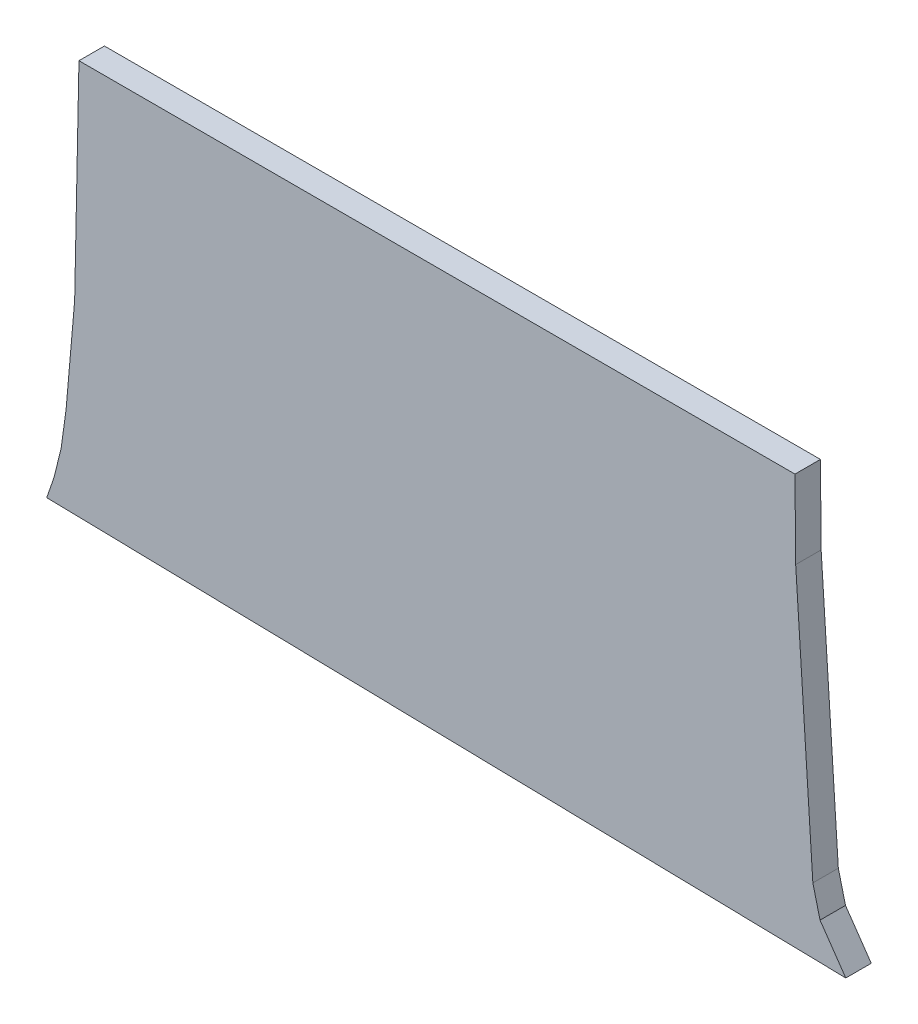
ISO-10303-21;
HEADER;
FILE_DESCRIPTION(('STEP AP214'),'2;1');
FILE_NAME('part.step','',(''),(''),'','','');
FILE_SCHEMA(('AUTOMOTIVE_DESIGN { 1 0 10303 214 1 1 1 1 }'));
ENDSEC;
DATA;
#1=APPLICATION_CONTEXT('core data for automotive mechanical design processes');
#2=APPLICATION_PROTOCOL_DEFINITION('international standard','automotive_design',2000,#1);
#3=PRODUCT_CONTEXT('',#1,'mechanical');
#4=PRODUCT('Part','Part','',(#3));
#5=PRODUCT_RELATED_PRODUCT_CATEGORY('part','',(#4));
#6=PRODUCT_DEFINITION_FORMATION('','',#4);
#7=PRODUCT_DEFINITION_CONTEXT('part definition',#1,'design');
#8=PRODUCT_DEFINITION('design','',#6,#7);
#9=PRODUCT_DEFINITION_SHAPE('','',#8);
#10=(LENGTH_UNIT() NAMED_UNIT(*) SI_UNIT(.MILLI.,.METRE.));
#11=(NAMED_UNIT(*) PLANE_ANGLE_UNIT() SI_UNIT($,.RADIAN.));
#12=(NAMED_UNIT(*) SI_UNIT($,.STERADIAN.) SOLID_ANGLE_UNIT());
#13=UNCERTAINTY_MEASURE_WITH_UNIT(LENGTH_MEASURE(1.E-05),#10,'distance_accuracy_value','');
#14=(GEOMETRIC_REPRESENTATION_CONTEXT(3) GLOBAL_UNCERTAINTY_ASSIGNED_CONTEXT((#13)) GLOBAL_UNIT_ASSIGNED_CONTEXT((#10,
#11,#12)) REPRESENTATION_CONTEXT('',''));
#15=CARTESIAN_POINT('',(0.,0.,0.));
#16=DIRECTION('',(0.,0.,1.));
#17=DIRECTION('',(1.,0.,0.));
#18=AXIS2_PLACEMENT_3D('',#15,#16,#17);
#19=CARTESIAN_POINT('',(34.8600006103516,114.917999267578,0.));
#20=DIRECTION('',(0.999790358166141,-0.0204753441489863,0.));
#21=DIRECTION('',(-0.0204753441489863,-0.999790358166141,0.));
#22=AXIS2_PLACEMENT_3D('',#19,#20,#21);
#23=PLANE('',#22);
#24=DIRECTION('',(-0.0204753441489863,-0.999790358166141,0.));
#25=VECTOR('',#24,1.);
#26=CARTESIAN_POINT('',(34.8600006103516,114.917999267578,0.03556));
#27=LINE('',#26,#25);
#28=CARTESIAN_POINT('',(34.8600006103516,114.917999267578,0.03556));
#29=VERTEX_POINT('',#28);
#30=CARTESIAN_POINT('',(34.8540000915527,114.625,0.03556));
#31=VERTEX_POINT('',#30);
#32=EDGE_CURVE('E11',#29,#31,#27,.T.);
#33=ORIENTED_EDGE('',*,*,#32,.F.);
#34=DIRECTION('',(0.,0.,1.));
#35=VECTOR('',#34,1.);
#36=CARTESIAN_POINT('',(34.8600006103516,114.917999267578,0.));
#37=LINE('',#36,#35);
#38=CARTESIAN_POINT('',(34.8600006103516,114.917999267578,0.));
#39=VERTEX_POINT('',#38);
#40=EDGE_CURVE('E24',#39,#29,#37,.T.);
#41=ORIENTED_EDGE('',*,*,#40,.F.);
#42=DIRECTION('',(-0.0204753441489863,-0.999790358166141,0.));
#43=VECTOR('',#42,1.);
#44=CARTESIAN_POINT('',(34.8600006103516,114.917999267578,0.));
#45=LINE('',#44,#43);
#46=CARTESIAN_POINT('',(34.8540000915527,114.625,0.));
#47=VERTEX_POINT('',#46);
#48=EDGE_CURVE('E118',#39,#47,#45,.T.);
#49=ORIENTED_EDGE('',*,*,#48,.T.);
#50=DIRECTION('',(0.,0.,1.));
#51=VECTOR('',#50,1.);
#52=CARTESIAN_POINT('',(34.8540000915527,114.625,0.));
#53=LINE('',#52,#51);
#54=EDGE_CURVE('E37',#47,#31,#53,.T.);
#55=ORIENTED_EDGE('',*,*,#54,.T.);
#56=EDGE_LOOP('',(#33,#41,#49,#55));
#57=FACE_BOUND('',#56,.T.);
#58=ADVANCED_FACE('F17',(#57),#23,.F.);
#59=CARTESIAN_POINT('',(34.8540000915527,114.625,0.));
#60=DIRECTION('',(0.99623996816194,-0.0866367464572496,0.));
#61=DIRECTION('',(-0.0866367464572496,-0.99623996816194,0.));
#62=AXIS2_PLACEMENT_3D('',#59,#60,#61);
#63=PLANE('',#62);
#64=DIRECTION('',(-0.0866367464572496,-0.99623996816194,0.));
#65=VECTOR('',#64,1.);
#66=CARTESIAN_POINT('',(34.8540000915527,114.625,0.03556));
#67=LINE('',#66,#65);
#68=CARTESIAN_POINT('',(34.8419990539551,114.486999511719,0.03556));
#69=VERTEX_POINT('',#68);
#70=EDGE_CURVE('E182',#31,#69,#67,.T.);
#71=ORIENTED_EDGE('',*,*,#70,.F.);
#72=ORIENTED_EDGE('',*,*,#54,.F.);
#73=DIRECTION('',(-0.0866367464572496,-0.99623996816194,0.));
#74=VECTOR('',#73,1.);
#75=CARTESIAN_POINT('',(34.8540000915527,114.625,0.));
#76=LINE('',#75,#74);
#77=CARTESIAN_POINT('',(34.8419990539551,114.486999511719,0.));
#78=VERTEX_POINT('',#77);
#79=EDGE_CURVE('E179',#47,#78,#76,.T.);
#80=ORIENTED_EDGE('',*,*,#79,.T.);
#81=DIRECTION('',(0.,0.,1.));
#82=VECTOR('',#81,1.);
#83=CARTESIAN_POINT('',(34.8419990539551,114.486999511719,0.));
#84=LINE('',#83,#82);
#85=EDGE_CURVE('E177',#78,#69,#84,.T.);
#86=ORIENTED_EDGE('',*,*,#85,.T.);
#87=EDGE_LOOP('',(#71,#72,#80,#86));
#88=FACE_BOUND('',#87,.T.);
#89=ADVANCED_FACE('F190',(#88),#63,.F.);
#90=CARTESIAN_POINT('',(34.8419990539551,114.486999511719,0.));
#91=DIRECTION('',(0.990712558253608,-0.135972890381105,0.));
#92=DIRECTION('',(-0.135972890381105,-0.990712558253608,0.));
#93=AXIS2_PLACEMENT_3D('',#90,#91,#92);
#94=PLANE('',#93);
#95=DIRECTION('',(-0.135972890381105,-0.990712558253608,0.));
#96=VECTOR('',#95,1.);
#97=CARTESIAN_POINT('',(34.8419990539551,114.486999511719,0.03556));
#98=LINE('',#97,#96);
#99=CARTESIAN_POINT('',(34.8349990844727,114.435997009277,0.03556));
#100=VERTEX_POINT('',#99);
#101=EDGE_CURVE('E174',#69,#100,#98,.T.);
#102=ORIENTED_EDGE('',*,*,#101,.F.);
#103=ORIENTED_EDGE('',*,*,#85,.F.);
#104=DIRECTION('',(-0.135972890381105,-0.990712558253608,0.));
#105=VECTOR('',#104,1.);
#106=CARTESIAN_POINT('',(34.8419990539551,114.486999511719,0.));
#107=LINE('',#106,#105);
#108=CARTESIAN_POINT('',(34.8349990844727,114.435997009277,0.));
#109=VERTEX_POINT('',#108);
#110=EDGE_CURVE('E171',#78,#109,#107,.T.);
#111=ORIENTED_EDGE('',*,*,#110,.T.);
#112=DIRECTION('',(0.,0.,1.));
#113=VECTOR('',#112,1.);
#114=CARTESIAN_POINT('',(34.8349990844727,114.435997009277,0.));
#115=LINE('',#114,#113);
#116=EDGE_CURVE('E169',#109,#100,#115,.T.);
#117=ORIENTED_EDGE('',*,*,#116,.T.);
#118=EDGE_LOOP('',(#102,#103,#111,#117));
#119=FACE_BOUND('',#118,.T.);
#120=ADVANCED_FACE('F196',(#119),#94,.F.);
#121=CARTESIAN_POINT('',(34.8349990844727,114.435997009277,0.));
#122=DIRECTION('',(0.970142500145332,-0.242535625036333,0.));
#123=DIRECTION('',(-0.242535625036333,-0.970142500145332,0.));
#124=AXIS2_PLACEMENT_3D('',#121,#122,#123);
#125=PLANE('',#124);
#126=DIRECTION('',(-0.242535625036333,-0.970142500145332,0.));
#127=VECTOR('',#126,1.);
#128=CARTESIAN_POINT('',(34.8349990844727,114.435997009277,0.03556));
#129=LINE('',#128,#127);
#130=CARTESIAN_POINT('',(34.8250007629395,114.396003723145,0.03556));
#131=VERTEX_POINT('',#130);
#132=EDGE_CURVE('E166',#100,#131,#129,.T.);
#133=ORIENTED_EDGE('',*,*,#132,.F.);
#134=ORIENTED_EDGE('',*,*,#116,.F.);
#135=DIRECTION('',(-0.242535625036333,-0.970142500145332,0.));
#136=VECTOR('',#135,1.);
#137=CARTESIAN_POINT('',(34.8349990844727,114.435997009277,0.));
#138=LINE('',#137,#136);
#139=CARTESIAN_POINT('',(34.8250007629395,114.396003723145,0.));
#140=VERTEX_POINT('',#139);
#141=EDGE_CURVE('E163',#109,#140,#138,.T.);
#142=ORIENTED_EDGE('',*,*,#141,.T.);
#143=DIRECTION('',(0.,0.,1.));
#144=VECTOR('',#143,1.);
#145=CARTESIAN_POINT('',(34.8250007629395,114.396003723145,0.));
#146=LINE('',#145,#144);
#147=EDGE_CURVE('E161',#140,#131,#146,.T.);
#148=ORIENTED_EDGE('',*,*,#147,.T.);
#149=EDGE_LOOP('',(#133,#134,#142,#148));
#150=FACE_BOUND('',#149,.T.);
#151=ADVANCED_FACE('F198',(#150),#125,.F.);
#152=CARTESIAN_POINT('',(34.8250007629395,114.396003723145,0.));
#153=DIRECTION('',(0.945375624020181,-0.325983020276291,0.));
#154=DIRECTION('',(-0.325983020276291,-0.945375624020181,0.));
#155=AXIS2_PLACEMENT_3D('',#152,#153,#154);
#156=PLANE('',#155);
#157=DIRECTION('',(-0.325983020276291,-0.945375624020181,0.));
#158=VECTOR('',#157,1.);
#159=CARTESIAN_POINT('',(34.8250007629395,114.396003723145,0.03556));
#160=LINE('',#159,#158);
#161=CARTESIAN_POINT('',(34.814998626709,114.366996765137,0.03556));
#162=VERTEX_POINT('',#161);
#163=EDGE_CURVE('E158',#131,#162,#160,.T.);
#164=ORIENTED_EDGE('',*,*,#163,.F.);
#165=ORIENTED_EDGE('',*,*,#147,.F.);
#166=DIRECTION('',(-0.325983020276291,-0.945375624020181,0.));
#167=VECTOR('',#166,1.);
#168=CARTESIAN_POINT('',(34.8250007629395,114.396003723145,0.));
#169=LINE('',#168,#167);
#170=CARTESIAN_POINT('',(34.814998626709,114.366996765137,0.));
#171=VERTEX_POINT('',#170);
#172=EDGE_CURVE('E155',#140,#171,#169,.T.);
#173=ORIENTED_EDGE('',*,*,#172,.T.);
#174=DIRECTION('',(0.,0.,1.));
#175=VECTOR('',#174,1.);
#176=CARTESIAN_POINT('',(34.814998626709,114.366996765137,0.));
#177=LINE('',#176,#175);
#178=EDGE_CURVE('E153',#171,#162,#177,.T.);
#179=ORIENTED_EDGE('',*,*,#178,.T.);
#180=EDGE_LOOP('',(#164,#165,#173,#179));
#181=FACE_BOUND('',#180,.T.);
#182=ADVANCED_FACE('F203',(#181),#156,.F.);
#183=CARTESIAN_POINT('',(34.814998626709,114.366996765137,0.));
#184=DIRECTION('',(0.0206004409063565,0.99978778840035,0.));
#185=DIRECTION('',(0.99978778840035,-0.0206004409063565,0.));
#186=AXIS2_PLACEMENT_3D('',#183,#184,#185);
#187=PLANE('',#186);
#188=DIRECTION('',(0.99978778840035,-0.0206004409063565,0.));
#189=VECTOR('',#188,1.);
#190=CARTESIAN_POINT('',(34.814998626709,114.366996765137,0.03556));
#191=LINE('',#190,#189);
#192=CARTESIAN_POINT('',(35.9309997558594,114.34400177002,0.03556));
#193=VERTEX_POINT('',#192);
#194=EDGE_CURVE('E150',#162,#193,#191,.T.);
#195=ORIENTED_EDGE('',*,*,#194,.F.);
#196=ORIENTED_EDGE('',*,*,#178,.F.);
#197=DIRECTION('',(0.99978778840035,-0.0206004409063565,0.));
#198=VECTOR('',#197,1.);
#199=CARTESIAN_POINT('',(34.814998626709,114.366996765137,0.));
#200=LINE('',#199,#198);
#201=CARTESIAN_POINT('',(35.9309997558594,114.34400177002,0.));
#202=VERTEX_POINT('',#201);
#203=EDGE_CURVE('E147',#171,#202,#200,.T.);
#204=ORIENTED_EDGE('',*,*,#203,.T.);
#205=DIRECTION('',(0.,0.,1.));
#206=VECTOR('',#205,1.);
#207=CARTESIAN_POINT('',(35.9309997558594,114.34400177002,0.));
#208=LINE('',#207,#206);
#209=EDGE_CURVE('E145',#202,#193,#208,.T.);
#210=ORIENTED_EDGE('',*,*,#209,.T.);
#211=EDGE_LOOP('',(#195,#196,#204,#210));
#212=FACE_BOUND('',#211,.T.);
#213=ADVANCED_FACE('F206',(#212),#187,.F.);
#214=CARTESIAN_POINT('',(35.9309997558594,114.34400177002,0.));
#215=DIRECTION('',(-0.822207390607001,-0.569188024146,0.));
#216=DIRECTION('',(-0.569188024146,0.822207390607001,0.));
#217=AXIS2_PLACEMENT_3D('',#214,#215,#216);
#218=PLANE('',#217);
#219=DIRECTION('',(-0.569188024146,0.822207390607001,0.));
#220=VECTOR('',#219,1.);
#221=CARTESIAN_POINT('',(35.9309997558594,114.34400177002,0.03556));
#222=LINE('',#221,#220);
#223=CARTESIAN_POINT('',(35.8950004577637,114.396003723145,0.03556));
#224=VERTEX_POINT('',#223);
#225=EDGE_CURVE('E142',#193,#224,#222,.T.);
#226=ORIENTED_EDGE('',*,*,#225,.F.);
#227=ORIENTED_EDGE('',*,*,#209,.F.);
#228=DIRECTION('',(-0.569188024146,0.822207390607001,0.));
#229=VECTOR('',#228,1.);
#230=CARTESIAN_POINT('',(35.9309997558594,114.34400177002,0.));
#231=LINE('',#230,#229);
#232=CARTESIAN_POINT('',(35.8950004577637,114.396003723145,0.));
#233=VERTEX_POINT('',#232);
#234=EDGE_CURVE('E139',#202,#233,#231,.T.);
#235=ORIENTED_EDGE('',*,*,#234,.T.);
#236=DIRECTION('',(0.,0.,1.));
#237=VECTOR('',#236,1.);
#238=CARTESIAN_POINT('',(35.8950004577637,114.396003723145,0.));
#239=LINE('',#238,#237);
#240=EDGE_CURVE('E137',#233,#224,#239,.T.);
#241=ORIENTED_EDGE('',*,*,#240,.T.);
#242=EDGE_LOOP('',(#226,#227,#235,#241));
#243=FACE_BOUND('',#242,.T.);
#244=ADVANCED_FACE('F211',(#243),#218,.F.);
#245=CARTESIAN_POINT('',(35.8950004577637,114.396003723145,0.));
#246=DIRECTION('',(-0.970120723659025,-0.242622714367986,0.));
#247=DIRECTION('',(-0.242622714367986,0.970120723659025,0.));
#248=AXIS2_PLACEMENT_3D('',#245,#246,#247);
#249=PLANE('',#248);
#250=DIRECTION('',(-0.242622714367986,0.970120723659025,0.));
#251=VECTOR('',#250,1.);
#252=CARTESIAN_POINT('',(35.8950004577637,114.396003723145,0.03556));
#253=LINE('',#252,#251);
#254=CARTESIAN_POINT('',(35.8849983215332,114.435997009277,0.03556));
#255=VERTEX_POINT('',#254);
#256=EDGE_CURVE('E134',#224,#255,#253,.T.);
#257=ORIENTED_EDGE('',*,*,#256,.F.);
#258=ORIENTED_EDGE('',*,*,#240,.F.);
#259=DIRECTION('',(-0.242622714367986,0.970120723659025,0.));
#260=VECTOR('',#259,1.);
#261=CARTESIAN_POINT('',(35.8950004577637,114.396003723145,0.));
#262=LINE('',#261,#260);
#263=CARTESIAN_POINT('',(35.8849983215332,114.435997009277,0.));
#264=VERTEX_POINT('',#263);
#265=EDGE_CURVE('E131',#233,#264,#262,.T.);
#266=ORIENTED_EDGE('',*,*,#265,.T.);
#267=DIRECTION('',(0.,0.,1.));
#268=VECTOR('',#267,1.);
#269=CARTESIAN_POINT('',(35.8849983215332,114.435997009277,0.));
#270=LINE('',#269,#268);
#271=EDGE_CURVE('E129',#264,#255,#270,.T.);
#272=ORIENTED_EDGE('',*,*,#271,.T.);
#273=EDGE_LOOP('',(#257,#258,#266,#272));
#274=FACE_BOUND('',#273,.T.);
#275=ADVANCED_FACE('F214',(#274),#249,.F.);
#276=CARTESIAN_POINT('',(35.8849983215332,114.435997009277,0.));
#277=DIRECTION('',(-0.997936694360059,-0.064205560894039,0.));
#278=DIRECTION('',(-0.064205560894039,0.997936694360059,0.));
#279=AXIS2_PLACEMENT_3D('',#276,#277,#278);
#280=PLANE('',#279);
#281=DIRECTION('',(-0.064205560894039,0.997936694360059,0.));
#282=VECTOR('',#281,1.);
#283=CARTESIAN_POINT('',(35.8849983215332,114.435997009277,0.03556));
#284=LINE('',#283,#282);
#285=CARTESIAN_POINT('',(35.8610000610351,114.80899810791,0.03556));
#286=VERTEX_POINT('',#285);
#287=EDGE_CURVE('E126',#255,#286,#284,.T.);
#288=ORIENTED_EDGE('',*,*,#287,.F.);
#289=ORIENTED_EDGE('',*,*,#271,.F.);
#290=DIRECTION('',(-0.064205560894039,0.997936694360059,0.));
#291=VECTOR('',#290,1.);
#292=CARTESIAN_POINT('',(35.8849983215332,114.435997009277,0.));
#293=LINE('',#292,#291);
#294=CARTESIAN_POINT('',(35.8610000610351,114.80899810791,0.));
#295=VERTEX_POINT('',#294);
#296=EDGE_CURVE('E124',#264,#295,#293,.T.);
#297=ORIENTED_EDGE('',*,*,#296,.T.);
#298=DIRECTION('',(0.,0.,1.));
#299=VECTOR('',#298,1.);
#300=CARTESIAN_POINT('',(35.8610000610351,114.80899810791,0.));
#301=LINE('',#300,#299);
#302=EDGE_CURVE('E109',#295,#286,#301,.T.);
#303=ORIENTED_EDGE('',*,*,#302,.T.);
#304=EDGE_LOOP('',(#288,#289,#297,#303));
#305=FACE_BOUND('',#304,.T.);
#306=ADVANCED_FACE('F217',(#305),#280,.F.);
#307=CARTESIAN_POINT('',(35.8610000610352,114.80899810791,0.));
#308=DIRECTION('',(-0.999957965767443,-0.0091687893550455,0.));
#309=DIRECTION('',(-0.0091687893550455,0.999957965767443,0.));
#310=AXIS2_PLACEMENT_3D('',#307,#308,#309);
#311=PLANE('',#310);
#312=DIRECTION('',(-0.0091687893550455,0.999957965767443,0.));
#313=VECTOR('',#312,1.);
#314=CARTESIAN_POINT('',(35.8610000610351,114.80899810791,0.03556));
#315=LINE('',#314,#313);
#316=CARTESIAN_POINT('',(35.8600006103516,114.917999267578,0.03556));
#317=VERTEX_POINT('',#316);
#318=EDGE_CURVE('E113',#286,#317,#315,.T.);
#319=ORIENTED_EDGE('',*,*,#318,.F.);
#320=ORIENTED_EDGE('',*,*,#302,.F.);
#321=DIRECTION('',(-0.0091687893550455,0.999957965767443,0.));
#322=VECTOR('',#321,1.);
#323=CARTESIAN_POINT('',(35.8610000610351,114.80899810791,0.));
#324=LINE('',#323,#322);
#325=CARTESIAN_POINT('',(35.8600006103516,114.917999267578,0.));
#326=VERTEX_POINT('',#325);
#327=EDGE_CURVE('E105',#295,#326,#324,.T.);
#328=ORIENTED_EDGE('',*,*,#327,.T.);
#329=DIRECTION('',(0.,0.,1.));
#330=VECTOR('',#329,1.);
#331=CARTESIAN_POINT('',(35.8600006103516,114.917999267578,0.));
#332=LINE('',#331,#330);
#333=EDGE_CURVE('E95',#326,#317,#332,.T.);
#334=ORIENTED_EDGE('',*,*,#333,.T.);
#335=EDGE_LOOP('',(#319,#320,#328,#334));
#336=FACE_BOUND('',#335,.T.);
#337=ADVANCED_FACE('F108',(#336),#311,.F.);
#338=CARTESIAN_POINT('',(35.8600006103516,114.917999267578,0.));
#339=DIRECTION('',(0.,-1.,0.));
#340=DIRECTION('',(-1.,0.,0.));
#341=AXIS2_PLACEMENT_3D('',#338,#339,#340);
#342=PLANE('',#341);
#343=DIRECTION('',(-1.,0.,0.));
#344=VECTOR('',#343,1.);
#345=CARTESIAN_POINT('',(35.8600006103516,114.917999267578,0.03556));
#346=LINE('',#345,#344);
#347=EDGE_CURVE('E101',#317,#29,#346,.T.);
#348=ORIENTED_EDGE('',*,*,#347,.F.);
#349=ORIENTED_EDGE('',*,*,#333,.F.);
#350=DIRECTION('',(-1.,0.,0.));
#351=VECTOR('',#350,1.);
#352=CARTESIAN_POINT('',(35.8600006103516,114.917999267578,0.));
#353=LINE('',#352,#351);
#354=EDGE_CURVE('E99',#326,#39,#353,.T.);
#355=ORIENTED_EDGE('',*,*,#354,.T.);
#356=ORIENTED_EDGE('',*,*,#40,.T.);
#357=EDGE_LOOP('',(#348,#349,#355,#356));
#358=FACE_BOUND('',#357,.T.);
#359=ADVANCED_FACE('F97',(#358),#342,.F.);
#360=CARTESIAN_POINT('',(34.8600006103516,114.917999267578,0.));
#361=DIRECTION('',(0.,0.,1.));
#362=DIRECTION('',(1.,0.,0.));
#363=AXIS2_PLACEMENT_3D('',#360,#361,#362);
#364=PLANE('',#363);
#365=ORIENTED_EDGE('',*,*,#354,.F.);
#366=ORIENTED_EDGE('',*,*,#327,.F.);
#367=ORIENTED_EDGE('',*,*,#296,.F.);
#368=ORIENTED_EDGE('',*,*,#265,.F.);
#369=ORIENTED_EDGE('',*,*,#234,.F.);
#370=ORIENTED_EDGE('',*,*,#203,.F.);
#371=ORIENTED_EDGE('',*,*,#172,.F.);
#372=ORIENTED_EDGE('',*,*,#141,.F.);
#373=ORIENTED_EDGE('',*,*,#110,.F.);
#374=ORIENTED_EDGE('',*,*,#79,.F.);
#375=ORIENTED_EDGE('',*,*,#48,.F.);
#376=EDGE_LOOP('',(#365,#366,#367,#368,#369,#370,#371,#372,#373,#374,#375));
#377=FACE_BOUND('',#376,.T.);
#378=ADVANCED_FACE('F116',(#377),#364,.F.);
#379=CARTESIAN_POINT('',(34.8600006103516,114.917999267578,0.03556));
#380=DIRECTION('',(0.,0.,1.));
#381=DIRECTION('',(1.,0.,0.));
#382=AXIS2_PLACEMENT_3D('',#379,#380,#381);
#383=PLANE('',#382);
#384=ORIENTED_EDGE('',*,*,#32,.T.);
#385=ORIENTED_EDGE('',*,*,#70,.T.);
#386=ORIENTED_EDGE('',*,*,#101,.T.);
#387=ORIENTED_EDGE('',*,*,#132,.T.);
#388=ORIENTED_EDGE('',*,*,#163,.T.);
#389=ORIENTED_EDGE('',*,*,#194,.T.);
#390=ORIENTED_EDGE('',*,*,#225,.T.);
#391=ORIENTED_EDGE('',*,*,#256,.T.);
#392=ORIENTED_EDGE('',*,*,#287,.T.);
#393=ORIENTED_EDGE('',*,*,#318,.T.);
#394=ORIENTED_EDGE('',*,*,#347,.T.);
#395=EDGE_LOOP('',(#384,#385,#386,#387,#388,#389,#390,#391,#392,#393,#394));
#396=FACE_BOUND('',#395,.T.);
#397=ADVANCED_FACE('F193',(#396),#383,.T.);
#398=CLOSED_SHELL('',(#58,#89,#120,#151,#182,#213,#244,#275,#306,#337,#359,#378,#397));
#399=MANIFOLD_SOLID_BREP('B1',#398);
#400=ADVANCED_BREP_SHAPE_REPRESENTATION('',(#18,#399),#14);
#401=SHAPE_DEFINITION_REPRESENTATION(#9,#400);
ENDSEC;
END-ISO-10303-21;
